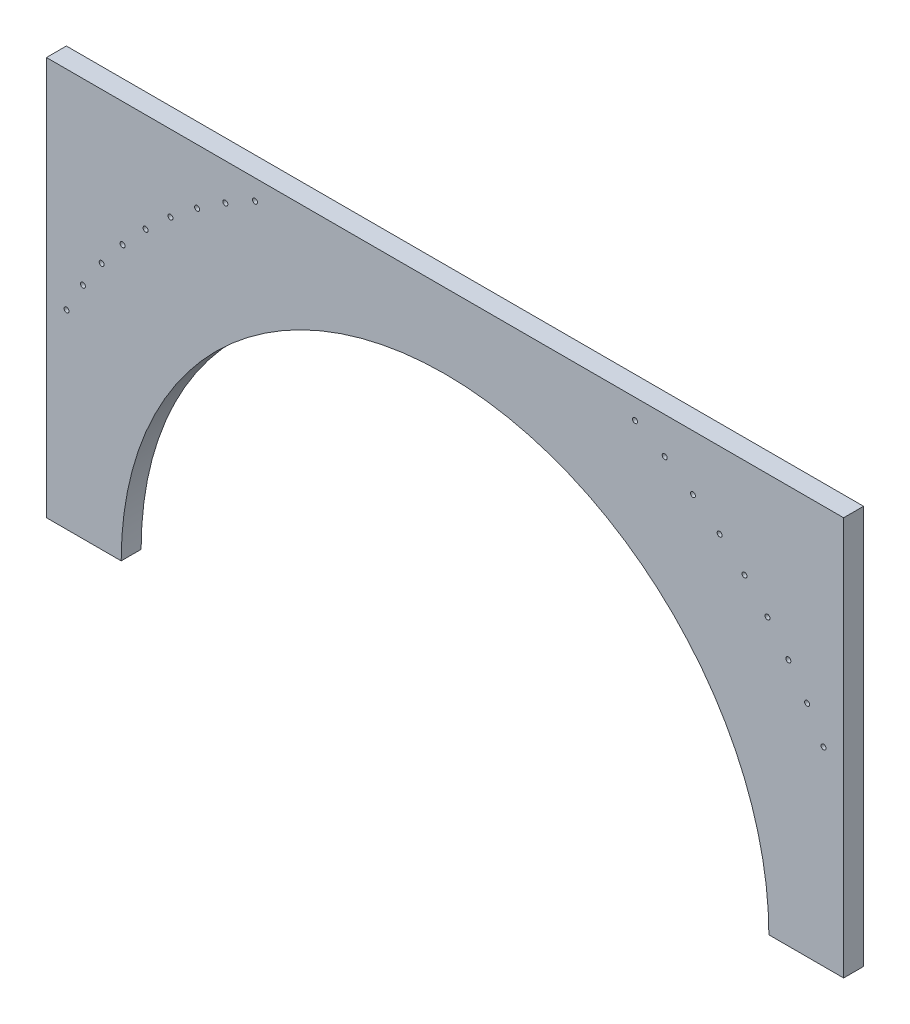
ISO-10303-21;
HEADER;
FILE_DESCRIPTION(('STEP AP214'),'2;1');
FILE_NAME('part.step','',(''),(''),'','','');
FILE_SCHEMA(('AUTOMOTIVE_DESIGN { 1 0 10303 214 1 1 1 1 }'));
ENDSEC;
DATA;
#1=APPLICATION_CONTEXT('core data for automotive mechanical design processes');
#2=APPLICATION_PROTOCOL_DEFINITION('international standard','automotive_design',2000,#1);
#3=PRODUCT_CONTEXT('',#1,'mechanical');
#4=PRODUCT('Part','Part','',(#3));
#5=PRODUCT_RELATED_PRODUCT_CATEGORY('part','',(#4));
#6=PRODUCT_DEFINITION_FORMATION('','',#4);
#7=PRODUCT_DEFINITION_CONTEXT('part definition',#1,'design');
#8=PRODUCT_DEFINITION('design','',#6,#7);
#9=PRODUCT_DEFINITION_SHAPE('','',#8);
#10=(LENGTH_UNIT() NAMED_UNIT(*) SI_UNIT(.MILLI.,.METRE.));
#11=(NAMED_UNIT(*) PLANE_ANGLE_UNIT() SI_UNIT($,.RADIAN.));
#12=(NAMED_UNIT(*) SI_UNIT($,.STERADIAN.) SOLID_ANGLE_UNIT());
#13=UNCERTAINTY_MEASURE_WITH_UNIT(LENGTH_MEASURE(1.E-05),#10,'distance_accuracy_value','');
#14=(GEOMETRIC_REPRESENTATION_CONTEXT(3) GLOBAL_UNCERTAINTY_ASSIGNED_CONTEXT((#13)) GLOBAL_UNIT_ASSIGNED_CONTEXT((#10,
#11,#12)) REPRESENTATION_CONTEXT('',''));
#15=CARTESIAN_POINT('',(0.,0.,0.));
#16=DIRECTION('',(0.,0.,1.));
#17=DIRECTION('',(1.,0.,0.));
#18=AXIS2_PLACEMENT_3D('',#15,#16,#17);
#19=CARTESIAN_POINT('',(40.,0.,2.));
#20=DIRECTION('',(0.,1.,0.));
#21=DIRECTION('',(-1.,0.,0.));
#22=AXIS2_PLACEMENT_3D('',#19,#20,#21);
#23=PLANE('',#22);
#24=DIRECTION('',(1.,0.,0.));
#25=VECTOR('',#24,1.);
#26=CARTESIAN_POINT('',(40.,0.,0.));
#27=LINE('',#26,#25);
#28=CARTESIAN_POINT('',(32.5,0.,0.));
#29=VERTEX_POINT('',#28);
#30=CARTESIAN_POINT('',(40.,0.,0.));
#31=VERTEX_POINT('',#30);
#32=EDGE_CURVE('E117',#29,#31,#27,.T.);
#33=ORIENTED_EDGE('',*,*,#32,.T.);
#34=DIRECTION('',(0.,0.,-1.));
#35=VECTOR('',#34,1.);
#36=CARTESIAN_POINT('',(40.,0.,2.));
#37=LINE('',#36,#35);
#38=CARTESIAN_POINT('',(40.,0.,2.));
#39=VERTEX_POINT('',#38);
#40=EDGE_CURVE('E11',#39,#31,#37,.T.);
#41=ORIENTED_EDGE('',*,*,#40,.F.);
#42=DIRECTION('',(1.,0.,0.));
#43=VECTOR('',#42,1.);
#44=CARTESIAN_POINT('',(40.,0.,2.));
#45=LINE('',#44,#43);
#46=CARTESIAN_POINT('',(32.5,0.,2.));
#47=VERTEX_POINT('',#46);
#48=EDGE_CURVE('E128',#47,#39,#45,.T.);
#49=ORIENTED_EDGE('',*,*,#48,.F.);
#50=DIRECTION('',(0.,0.,-1.));
#51=VECTOR('',#50,1.);
#52=CARTESIAN_POINT('',(32.5,0.,2.));
#53=LINE('',#52,#51);
#54=EDGE_CURVE('E113',#47,#29,#53,.T.);
#55=ORIENTED_EDGE('',*,*,#54,.T.);
#56=EDGE_LOOP('',(#33,#41,#49,#55));
#57=FACE_BOUND('',#56,.T.);
#58=ADVANCED_FACE('F33',(#57),#23,.F.);
#59=CARTESIAN_POINT('',(40.,0.,2.));
#60=DIRECTION('',(-1.,0.,0.));
#61=DIRECTION('',(0.,-1.,0.));
#62=AXIS2_PLACEMENT_3D('',#59,#60,#61);
#63=PLANE('',#62);
#64=DIRECTION('',(0.,1.,0.));
#65=VECTOR('',#64,1.);
#66=CARTESIAN_POINT('',(40.,0.,0.));
#67=LINE('',#66,#65);
#68=CARTESIAN_POINT('',(40.,40.,0.));
#69=VERTEX_POINT('',#68);
#70=EDGE_CURVE('E120',#31,#69,#67,.T.);
#71=ORIENTED_EDGE('',*,*,#70,.T.);
#72=DIRECTION('',(0.,0.,-1.));
#73=VECTOR('',#72,1.);
#74=CARTESIAN_POINT('',(40.,40.,2.));
#75=LINE('',#74,#73);
#76=CARTESIAN_POINT('',(40.,40.,2.));
#77=VERTEX_POINT('',#76);
#78=EDGE_CURVE('E41',#77,#69,#75,.T.);
#79=ORIENTED_EDGE('',*,*,#78,.F.);
#80=DIRECTION('',(0.,1.,0.));
#81=VECTOR('',#80,1.);
#82=CARTESIAN_POINT('',(40.,0.,2.));
#83=LINE('',#82,#81);
#84=EDGE_CURVE('E86',#39,#77,#83,.T.);
#85=ORIENTED_EDGE('',*,*,#84,.F.);
#86=ORIENTED_EDGE('',*,*,#40,.T.);
#87=EDGE_LOOP('',(#71,#79,#85,#86));
#88=FACE_BOUND('',#87,.T.);
#89=ADVANCED_FACE('F153',(#88),#63,.F.);
#90=CARTESIAN_POINT('',(40.,40.,2.));
#91=DIRECTION('',(0.,-1.,0.));
#92=DIRECTION('',(1.,0.,0.));
#93=AXIS2_PLACEMENT_3D('',#90,#91,#92);
#94=PLANE('',#93);
#95=DIRECTION('',(-1.,0.,0.));
#96=VECTOR('',#95,1.);
#97=CARTESIAN_POINT('',(40.,40.,0.));
#98=LINE('',#97,#96);
#99=CARTESIAN_POINT('',(-40.,40.,0.));
#100=VERTEX_POINT('',#99);
#101=EDGE_CURVE('E123',#69,#100,#98,.T.);
#102=ORIENTED_EDGE('',*,*,#101,.T.);
#103=DIRECTION('',(0.,0.,-1.));
#104=VECTOR('',#103,1.);
#105=CARTESIAN_POINT('',(-40.,40.,2.));
#106=LINE('',#105,#104);
#107=CARTESIAN_POINT('',(-40.,40.,2.));
#108=VERTEX_POINT('',#107);
#109=EDGE_CURVE('E108',#108,#100,#106,.T.);
#110=ORIENTED_EDGE('',*,*,#109,.F.);
#111=DIRECTION('',(-1.,0.,0.));
#112=VECTOR('',#111,1.);
#113=CARTESIAN_POINT('',(40.,40.,2.));
#114=LINE('',#113,#112);
#115=EDGE_CURVE('E99',#77,#108,#114,.T.);
#116=ORIENTED_EDGE('',*,*,#115,.F.);
#117=ORIENTED_EDGE('',*,*,#78,.T.);
#118=EDGE_LOOP('',(#102,#110,#116,#117));
#119=FACE_BOUND('',#118,.T.);
#120=ADVANCED_FACE('F134',(#119),#94,.F.);
#121=CARTESIAN_POINT('',(-40.,40.,2.));
#122=DIRECTION('',(1.,0.,0.));
#123=DIRECTION('',(0.,1.,0.));
#124=AXIS2_PLACEMENT_3D('',#121,#122,#123);
#125=PLANE('',#124);
#126=DIRECTION('',(0.,-1.,0.));
#127=VECTOR('',#126,1.);
#128=CARTESIAN_POINT('',(-40.,40.,0.));
#129=LINE('',#128,#127);
#130=CARTESIAN_POINT('',(-40.,0.,0.));
#131=VERTEX_POINT('',#130);
#132=EDGE_CURVE('E107',#100,#131,#129,.T.);
#133=ORIENTED_EDGE('',*,*,#132,.T.);
#134=DIRECTION('',(0.,0.,-1.));
#135=VECTOR('',#134,1.);
#136=CARTESIAN_POINT('',(-40.,0.,2.));
#137=LINE('',#136,#135);
#138=CARTESIAN_POINT('',(-40.,0.,2.));
#139=VERTEX_POINT('',#138);
#140=EDGE_CURVE('E104',#139,#131,#137,.T.);
#141=ORIENTED_EDGE('',*,*,#140,.F.);
#142=DIRECTION('',(0.,-1.,0.));
#143=VECTOR('',#142,1.);
#144=CARTESIAN_POINT('',(-40.,40.,2.));
#145=LINE('',#144,#143);
#146=EDGE_CURVE('E93',#108,#139,#145,.T.);
#147=ORIENTED_EDGE('',*,*,#146,.F.);
#148=ORIENTED_EDGE('',*,*,#109,.T.);
#149=EDGE_LOOP('',(#133,#141,#147,#148));
#150=FACE_BOUND('',#149,.T.);
#151=ADVANCED_FACE('F105',(#150),#125,.F.);
#152=CARTESIAN_POINT('',(-32.5,0.,2.));
#153=DIRECTION('',(0.,1.,0.));
#154=DIRECTION('',(-1.,0.,0.));
#155=AXIS2_PLACEMENT_3D('',#152,#153,#154);
#156=PLANE('',#155);
#157=DIRECTION('',(1.,0.,0.));
#158=VECTOR('',#157,1.);
#159=CARTESIAN_POINT('',(-32.5,0.,0.));
#160=LINE('',#159,#158);
#161=CARTESIAN_POINT('',(-32.5,0.,0.));
#162=VERTEX_POINT('',#161);
#163=EDGE_CURVE('E72',#131,#162,#160,.T.);
#164=ORIENTED_EDGE('',*,*,#163,.T.);
#165=DIRECTION('',(0.,0.,-1.));
#166=VECTOR('',#165,1.);
#167=CARTESIAN_POINT('',(-32.5,0.,2.));
#168=LINE('',#167,#166);
#169=CARTESIAN_POINT('',(-32.5,0.,2.));
#170=VERTEX_POINT('',#169);
#171=EDGE_CURVE('E109',#170,#162,#168,.T.);
#172=ORIENTED_EDGE('',*,*,#171,.F.);
#173=DIRECTION('',(1.,0.,0.));
#174=VECTOR('',#173,1.);
#175=CARTESIAN_POINT('',(-32.5,0.,2.));
#176=LINE('',#175,#174);
#177=EDGE_CURVE('E97',#139,#170,#176,.T.);
#178=ORIENTED_EDGE('',*,*,#177,.F.);
#179=ORIENTED_EDGE('',*,*,#140,.T.);
#180=EDGE_LOOP('',(#164,#172,#178,#179));
#181=FACE_BOUND('',#180,.T.);
#182=ADVANCED_FACE('F111',(#181),#156,.F.);
#183=CARTESIAN_POINT('',(0.,0.,2.));
#184=DIRECTION('',(0.,0.,-1.));
#185=DIRECTION('',(-1.,0.,0.));
#186=AXIS2_PLACEMENT_3D('',#183,#184,#185);
#187=CYLINDRICAL_SURFACE('',#186,32.5);
#188=CARTESIAN_POINT('',(0.,0.,0.));
#189=DIRECTION('',(0.,0.,-1.));
#190=DIRECTION('',(1.,0.,0.));
#191=AXIS2_PLACEMENT_3D('',#188,#189,#190);
#192=CIRCLE('',#191,32.5);
#193=EDGE_CURVE('E78',#162,#29,#192,.T.);
#194=ORIENTED_EDGE('',*,*,#193,.T.);
#195=ORIENTED_EDGE('',*,*,#54,.F.);
#196=CARTESIAN_POINT('',(0.,0.,2.));
#197=DIRECTION('',(0.,0.,-1.));
#198=DIRECTION('',(1.,0.,0.));
#199=AXIS2_PLACEMENT_3D('',#196,#197,#198);
#200=CIRCLE('',#199,32.5);
#201=EDGE_CURVE('E49',#170,#47,#200,.T.);
#202=ORIENTED_EDGE('',*,*,#201,.F.);
#203=ORIENTED_EDGE('',*,*,#171,.T.);
#204=EDGE_LOOP('',(#194,#195,#202,#203));
#205=FACE_BOUND('',#204,.T.);
#206=ADVANCED_FACE('F141',(#205),#187,.F.);
#207=CARTESIAN_POINT('',(0.,0.,2.));
#208=DIRECTION('',(0.,0.,1.));
#209=DIRECTION('',(1.,0.,0.));
#210=AXIS2_PLACEMENT_3D('',#207,#208,#209);
#211=PLANE('',#210);
#212=CARTESIAN_POINT('',(37.9814539466944,19.0698493988598,2.));
#213=DIRECTION('',(0.,0.,1.));
#214=DIRECTION('',(-1.,0.,0.));
#215=AXIS2_PLACEMENT_3D('',#212,#213,#214);
#216=CIRCLE('',#215,0.25);
#217=CARTESIAN_POINT('',(37.7314539466944,19.0698493988598,2.));
#218=VERTEX_POINT('',#217);
#219=EDGE_CURVE('E379',#218,#218,#216,.T.);
#220=ORIENTED_EDGE('',*,*,#219,.F.);
#221=EDGE_LOOP('',(#220));
#222=FACE_BOUND('',#221,.T.);
#223=CARTESIAN_POINT('',(36.3355463010969,22.0449104103625,2.));
#224=DIRECTION('',(0.,0.,1.));
#225=DIRECTION('',(-1.,0.,0.));
#226=AXIS2_PLACEMENT_3D('',#223,#224,#225);
#227=CIRCLE('',#226,0.25);
#228=CARTESIAN_POINT('',(36.0855463010969,22.0449104103625,2.));
#229=VERTEX_POINT('',#228);
#230=EDGE_CURVE('E381',#229,#229,#227,.T.);
#231=ORIENTED_EDGE('',*,*,#230,.F.);
#232=EDGE_LOOP('',(#231));
#233=FACE_BOUND('',#232,.T.);
#234=CARTESIAN_POINT('',(34.4570911591722,24.8788839952389,2.));
#235=DIRECTION('',(0.,0.,1.));
#236=DIRECTION('',(-1.,0.,0.));
#237=AXIS2_PLACEMENT_3D('',#234,#235,#236);
#238=CIRCLE('',#237,0.249999999999993);
#239=CARTESIAN_POINT('',(34.2070911591723,24.8788839952389,2.));
#240=VERTEX_POINT('',#239);
#241=EDGE_CURVE('E387',#240,#240,#238,.T.);
#242=ORIENTED_EDGE('',*,*,#241,.F.);
#243=EDGE_LOOP('',(#242));
#244=FACE_BOUND('',#243,.T.);
#245=CARTESIAN_POINT('',(32.358110633829,27.5536327225457,2.));
#246=DIRECTION('',(0.,0.,1.));
#247=DIRECTION('',(-1.,0.,0.));
#248=AXIS2_PLACEMENT_3D('',#245,#246,#247);
#249=CIRCLE('',#248,0.250000000000006);
#250=CARTESIAN_POINT('',(32.1081106338289,27.5536327225457,2.));
#251=VERTEX_POINT('',#250);
#252=EDGE_CURVE('E393',#251,#251,#249,.T.);
#253=ORIENTED_EDGE('',*,*,#252,.F.);
#254=EDGE_LOOP('',(#253));
#255=FACE_BOUND('',#254,.T.);
#256=CARTESIAN_POINT('',(30.0520382004291,30.0520382004283,2.));
#257=DIRECTION('',(0.,0.,1.));
#258=DIRECTION('',(-1.,0.,0.));
#259=AXIS2_PLACEMENT_3D('',#256,#257,#258);
#260=CIRCLE('',#259,0.249999999999992);
#261=CARTESIAN_POINT('',(29.8020382004291,30.0520382004283,2.));
#262=VERTEX_POINT('',#261);
#263=EDGE_CURVE('E399',#262,#262,#260,.T.);
#264=ORIENTED_EDGE('',*,*,#263,.F.);
#265=EDGE_LOOP('',(#264));
#266=FACE_BOUND('',#265,.T.);
#267=CARTESIAN_POINT('',(27.5536327225466,32.358110633828,2.));
#268=DIRECTION('',(0.,0.,1.));
#269=DIRECTION('',(-1.,0.,0.));
#270=AXIS2_PLACEMENT_3D('',#267,#268,#269);
#271=CIRCLE('',#270,0.25);
#272=CARTESIAN_POINT('',(27.3036327225466,32.358110633828,2.));
#273=VERTEX_POINT('',#272);
#274=EDGE_CURVE('E405',#273,#273,#271,.T.);
#275=ORIENTED_EDGE('',*,*,#274,.F.);
#276=EDGE_LOOP('',(#275));
#277=FACE_BOUND('',#276,.T.);
#278=CARTESIAN_POINT('',(24.8788839952397,34.4570911591713,2.));
#279=DIRECTION('',(0.,0.,1.));
#280=DIRECTION('',(-1.,0.,0.));
#281=AXIS2_PLACEMENT_3D('',#278,#279,#280);
#282=CIRCLE('',#281,0.250000000000003);
#283=CARTESIAN_POINT('',(24.6288839952397,34.4570911591713,2.));
#284=VERTEX_POINT('',#283);
#285=EDGE_CURVE('E411',#284,#284,#282,.T.);
#286=ORIENTED_EDGE('',*,*,#285,.F.);
#287=EDGE_LOOP('',(#286));
#288=FACE_BOUND('',#287,.T.);
#289=CARTESIAN_POINT('',(22.0449104103634,36.335546301096,2.));
#290=DIRECTION('',(0.,0.,1.));
#291=DIRECTION('',(-1.,0.,0.));
#292=AXIS2_PLACEMENT_3D('',#289,#290,#291);
#293=CIRCLE('',#292,0.25);
#294=CARTESIAN_POINT('',(21.7949104103634,36.335546301096,2.));
#295=VERTEX_POINT('',#294);
#296=EDGE_CURVE('E417',#295,#295,#293,.T.);
#297=ORIENTED_EDGE('',*,*,#296,.F.);
#298=EDGE_LOOP('',(#297));
#299=FACE_BOUND('',#298,.T.);
#300=CARTESIAN_POINT('',(19.0698493988607,37.9814539466935,2.));
#301=DIRECTION('',(0.,0.,1.));
#302=DIRECTION('',(-1.,0.,0.));
#303=AXIS2_PLACEMENT_3D('',#300,#301,#302);
#304=CIRCLE('',#303,0.250000000000006);
#305=CARTESIAN_POINT('',(18.8198493988607,37.9814539466935,2.));
#306=VERTEX_POINT('',#305);
#307=EDGE_CURVE('E423',#306,#306,#304,.T.);
#308=ORIENTED_EDGE('',*,*,#307,.F.);
#309=EDGE_LOOP('',(#308));
#310=FACE_BOUND('',#309,.T.);
#311=CARTESIAN_POINT('',(-19.0698493988607,37.9814539466935,2.));
#312=DIRECTION('',(0.,0.,1.));
#313=DIRECTION('',(1.,0.,0.));
#314=AXIS2_PLACEMENT_3D('',#311,#312,#313);
#315=CIRCLE('',#314,0.250000000000006);
#316=CARTESIAN_POINT('',(-18.8198493988607,37.9814539466935,2.));
#317=VERTEX_POINT('',#316);
#318=EDGE_CURVE('E429',#317,#317,#315,.T.);
#319=ORIENTED_EDGE('',*,*,#318,.F.);
#320=EDGE_LOOP('',(#319));
#321=FACE_BOUND('',#320,.T.);
#322=CARTESIAN_POINT('',(-22.0449104103634,36.335546301096,2.));
#323=DIRECTION('',(0.,0.,1.));
#324=DIRECTION('',(1.,0.,0.));
#325=AXIS2_PLACEMENT_3D('',#322,#323,#324);
#326=CIRCLE('',#325,0.25);
#327=CARTESIAN_POINT('',(-21.7949104103634,36.335546301096,2.));
#328=VERTEX_POINT('',#327);
#329=EDGE_CURVE('E435',#328,#328,#326,.T.);
#330=ORIENTED_EDGE('',*,*,#329,.F.);
#331=EDGE_LOOP('',(#330));
#332=FACE_BOUND('',#331,.T.);
#333=CARTESIAN_POINT('',(-24.8788839952397,34.4570911591713,2.));
#334=DIRECTION('',(0.,0.,1.));
#335=DIRECTION('',(1.,0.,0.));
#336=AXIS2_PLACEMENT_3D('',#333,#334,#335);
#337=CIRCLE('',#336,0.250000000000003);
#338=CARTESIAN_POINT('',(-24.6288839952397,34.4570911591713,2.));
#339=VERTEX_POINT('',#338);
#340=EDGE_CURVE('E441',#339,#339,#337,.T.);
#341=ORIENTED_EDGE('',*,*,#340,.F.);
#342=EDGE_LOOP('',(#341));
#343=FACE_BOUND('',#342,.T.);
#344=CARTESIAN_POINT('',(-27.5536327225466,32.358110633828,2.));
#345=DIRECTION('',(0.,0.,1.));
#346=DIRECTION('',(1.,0.,0.));
#347=AXIS2_PLACEMENT_3D('',#344,#345,#346);
#348=CIRCLE('',#347,0.25);
#349=CARTESIAN_POINT('',(-27.3036327225466,32.358110633828,2.));
#350=VERTEX_POINT('',#349);
#351=EDGE_CURVE('E447',#350,#350,#348,.T.);
#352=ORIENTED_EDGE('',*,*,#351,.F.);
#353=EDGE_LOOP('',(#352));
#354=FACE_BOUND('',#353,.T.);
#355=CARTESIAN_POINT('',(-30.0520382004291,30.0520382004283,2.));
#356=DIRECTION('',(0.,0.,1.));
#357=DIRECTION('',(1.,0.,0.));
#358=AXIS2_PLACEMENT_3D('',#355,#356,#357);
#359=CIRCLE('',#358,0.249999999999992);
#360=CARTESIAN_POINT('',(-29.8020382004291,30.0520382004283,2.));
#361=VERTEX_POINT('',#360);
#362=EDGE_CURVE('E453',#361,#361,#359,.T.);
#363=ORIENTED_EDGE('',*,*,#362,.F.);
#364=EDGE_LOOP('',(#363));
#365=FACE_BOUND('',#364,.T.);
#366=CARTESIAN_POINT('',(-32.358110633829,27.5536327225457,2.));
#367=DIRECTION('',(0.,0.,1.));
#368=DIRECTION('',(1.,0.,0.));
#369=AXIS2_PLACEMENT_3D('',#366,#367,#368);
#370=CIRCLE('',#369,0.250000000000006);
#371=CARTESIAN_POINT('',(-32.1081106338289,27.5536327225457,2.));
#372=VERTEX_POINT('',#371);
#373=EDGE_CURVE('E459',#372,#372,#370,.T.);
#374=ORIENTED_EDGE('',*,*,#373,.F.);
#375=EDGE_LOOP('',(#374));
#376=FACE_BOUND('',#375,.T.);
#377=CARTESIAN_POINT('',(-34.4570911591722,24.8788839952389,2.));
#378=DIRECTION('',(0.,0.,1.));
#379=DIRECTION('',(1.,0.,0.));
#380=AXIS2_PLACEMENT_3D('',#377,#378,#379);
#381=CIRCLE('',#380,0.249999999999993);
#382=CARTESIAN_POINT('',(-34.2070911591723,24.8788839952389,2.));
#383=VERTEX_POINT('',#382);
#384=EDGE_CURVE('E465',#383,#383,#381,.T.);
#385=ORIENTED_EDGE('',*,*,#384,.F.);
#386=EDGE_LOOP('',(#385));
#387=FACE_BOUND('',#386,.T.);
#388=CARTESIAN_POINT('',(-36.3355463010969,22.0449104103625,2.));
#389=DIRECTION('',(0.,0.,1.));
#390=DIRECTION('',(1.,0.,0.));
#391=AXIS2_PLACEMENT_3D('',#388,#389,#390);
#392=CIRCLE('',#391,0.25);
#393=CARTESIAN_POINT('',(-36.0855463010969,22.0449104103625,2.));
#394=VERTEX_POINT('',#393);
#395=EDGE_CURVE('E471',#394,#394,#392,.T.);
#396=ORIENTED_EDGE('',*,*,#395,.F.);
#397=EDGE_LOOP('',(#396));
#398=FACE_BOUND('',#397,.T.);
#399=CARTESIAN_POINT('',(-37.9814539466944,19.0698493988598,2.));
#400=DIRECTION('',(0.,0.,1.));
#401=DIRECTION('',(1.,0.,0.));
#402=AXIS2_PLACEMENT_3D('',#399,#400,#401);
#403=CIRCLE('',#402,0.25);
#404=CARTESIAN_POINT('',(-37.7314539466944,19.0698493988598,2.));
#405=VERTEX_POINT('',#404);
#406=EDGE_CURVE('E477',#405,#405,#403,.T.);
#407=ORIENTED_EDGE('',*,*,#406,.F.);
#408=EDGE_LOOP('',(#407));
#409=FACE_BOUND('',#408,.T.);
#410=ORIENTED_EDGE('',*,*,#48,.T.);
#411=ORIENTED_EDGE('',*,*,#84,.T.);
#412=ORIENTED_EDGE('',*,*,#115,.T.);
#413=ORIENTED_EDGE('',*,*,#146,.T.);
#414=ORIENTED_EDGE('',*,*,#177,.T.);
#415=ORIENTED_EDGE('',*,*,#201,.T.);
#416=EDGE_LOOP('',(#410,#411,#412,#413,#414,#415));
#417=FACE_BOUND('',#416,.T.);
#418=ADVANCED_FACE('F95',(#222,#233,#244,#255,#266,#277,#288,#299,#310,#321,#332,#343,#354,#365,
#376,#387,#398,#409,#417),#211,.T.);
#419=CARTESIAN_POINT('',(0.,0.,0.));
#420=DIRECTION('',(0.,0.,1.));
#421=DIRECTION('',(1.,0.,0.));
#422=AXIS2_PLACEMENT_3D('',#419,#420,#421);
#423=PLANE('',#422);
#424=CARTESIAN_POINT('',(37.9814539466944,19.0698493988598,0.));
#425=DIRECTION('',(0.,0.,1.));
#426=DIRECTION('',(-1.,0.,0.));
#427=AXIS2_PLACEMENT_3D('',#424,#425,#426);
#428=CIRCLE('',#427,0.25);
#429=CARTESIAN_POINT('',(37.7314539466944,19.0698493988598,0.));
#430=VERTEX_POINT('',#429);
#431=EDGE_CURVE('E376',#430,#430,#428,.T.);
#432=ORIENTED_EDGE('',*,*,#431,.T.);
#433=EDGE_LOOP('',(#432));
#434=FACE_BOUND('',#433,.T.);
#435=CARTESIAN_POINT('',(36.3355463010969,22.0449104103625,0.));
#436=DIRECTION('',(0.,0.,1.));
#437=DIRECTION('',(-1.,0.,0.));
#438=AXIS2_PLACEMENT_3D('',#435,#436,#437);
#439=CIRCLE('',#438,0.25);
#440=CARTESIAN_POINT('',(36.0855463010969,22.0449104103625,0.));
#441=VERTEX_POINT('',#440);
#442=EDGE_CURVE('E384',#441,#441,#439,.T.);
#443=ORIENTED_EDGE('',*,*,#442,.T.);
#444=EDGE_LOOP('',(#443));
#445=FACE_BOUND('',#444,.T.);
#446=CARTESIAN_POINT('',(34.4570911591722,24.8788839952389,0.));
#447=DIRECTION('',(0.,0.,1.));
#448=DIRECTION('',(-1.,0.,0.));
#449=AXIS2_PLACEMENT_3D('',#446,#447,#448);
#450=CIRCLE('',#449,0.249999999999993);
#451=CARTESIAN_POINT('',(34.2070911591723,24.8788839952389,0.));
#452=VERTEX_POINT('',#451);
#453=EDGE_CURVE('E390',#452,#452,#450,.T.);
#454=ORIENTED_EDGE('',*,*,#453,.T.);
#455=EDGE_LOOP('',(#454));
#456=FACE_BOUND('',#455,.T.);
#457=CARTESIAN_POINT('',(32.358110633829,27.5536327225457,0.));
#458=DIRECTION('',(0.,0.,1.));
#459=DIRECTION('',(-1.,0.,0.));
#460=AXIS2_PLACEMENT_3D('',#457,#458,#459);
#461=CIRCLE('',#460,0.250000000000006);
#462=CARTESIAN_POINT('',(32.1081106338289,27.5536327225457,0.));
#463=VERTEX_POINT('',#462);
#464=EDGE_CURVE('E396',#463,#463,#461,.T.);
#465=ORIENTED_EDGE('',*,*,#464,.T.);
#466=EDGE_LOOP('',(#465));
#467=FACE_BOUND('',#466,.T.);
#468=CARTESIAN_POINT('',(30.0520382004291,30.0520382004283,0.));
#469=DIRECTION('',(0.,0.,1.));
#470=DIRECTION('',(-1.,0.,0.));
#471=AXIS2_PLACEMENT_3D('',#468,#469,#470);
#472=CIRCLE('',#471,0.249999999999992);
#473=CARTESIAN_POINT('',(29.8020382004291,30.0520382004283,0.));
#474=VERTEX_POINT('',#473);
#475=EDGE_CURVE('E402',#474,#474,#472,.T.);
#476=ORIENTED_EDGE('',*,*,#475,.T.);
#477=EDGE_LOOP('',(#476));
#478=FACE_BOUND('',#477,.T.);
#479=CARTESIAN_POINT('',(27.5536327225466,32.358110633828,0.));
#480=DIRECTION('',(0.,0.,1.));
#481=DIRECTION('',(-1.,0.,0.));
#482=AXIS2_PLACEMENT_3D('',#479,#480,#481);
#483=CIRCLE('',#482,0.25);
#484=CARTESIAN_POINT('',(27.3036327225466,32.358110633828,0.));
#485=VERTEX_POINT('',#484);
#486=EDGE_CURVE('E408',#485,#485,#483,.T.);
#487=ORIENTED_EDGE('',*,*,#486,.T.);
#488=EDGE_LOOP('',(#487));
#489=FACE_BOUND('',#488,.T.);
#490=CARTESIAN_POINT('',(24.8788839952397,34.4570911591713,0.));
#491=DIRECTION('',(0.,0.,1.));
#492=DIRECTION('',(-1.,0.,0.));
#493=AXIS2_PLACEMENT_3D('',#490,#491,#492);
#494=CIRCLE('',#493,0.250000000000003);
#495=CARTESIAN_POINT('',(24.6288839952397,34.4570911591713,0.));
#496=VERTEX_POINT('',#495);
#497=EDGE_CURVE('E414',#496,#496,#494,.T.);
#498=ORIENTED_EDGE('',*,*,#497,.T.);
#499=EDGE_LOOP('',(#498));
#500=FACE_BOUND('',#499,.T.);
#501=CARTESIAN_POINT('',(22.0449104103634,36.335546301096,0.));
#502=DIRECTION('',(0.,0.,1.));
#503=DIRECTION('',(-1.,0.,0.));
#504=AXIS2_PLACEMENT_3D('',#501,#502,#503);
#505=CIRCLE('',#504,0.25);
#506=CARTESIAN_POINT('',(21.7949104103634,36.335546301096,0.));
#507=VERTEX_POINT('',#506);
#508=EDGE_CURVE('E420',#507,#507,#505,.T.);
#509=ORIENTED_EDGE('',*,*,#508,.T.);
#510=EDGE_LOOP('',(#509));
#511=FACE_BOUND('',#510,.T.);
#512=CARTESIAN_POINT('',(19.0698493988607,37.9814539466935,0.));
#513=DIRECTION('',(0.,0.,1.));
#514=DIRECTION('',(-1.,0.,0.));
#515=AXIS2_PLACEMENT_3D('',#512,#513,#514);
#516=CIRCLE('',#515,0.250000000000006);
#517=CARTESIAN_POINT('',(18.8198493988607,37.9814539466935,0.));
#518=VERTEX_POINT('',#517);
#519=EDGE_CURVE('E426',#518,#518,#516,.T.);
#520=ORIENTED_EDGE('',*,*,#519,.T.);
#521=EDGE_LOOP('',(#520));
#522=FACE_BOUND('',#521,.T.);
#523=CARTESIAN_POINT('',(-19.0698493988607,37.9814539466935,0.));
#524=DIRECTION('',(0.,0.,1.));
#525=DIRECTION('',(1.,0.,0.));
#526=AXIS2_PLACEMENT_3D('',#523,#524,#525);
#527=CIRCLE('',#526,0.250000000000006);
#528=CARTESIAN_POINT('',(-18.8198493988607,37.9814539466935,0.));
#529=VERTEX_POINT('',#528);
#530=EDGE_CURVE('E432',#529,#529,#527,.T.);
#531=ORIENTED_EDGE('',*,*,#530,.T.);
#532=EDGE_LOOP('',(#531));
#533=FACE_BOUND('',#532,.T.);
#534=CARTESIAN_POINT('',(-22.0449104103634,36.335546301096,0.));
#535=DIRECTION('',(0.,0.,1.));
#536=DIRECTION('',(1.,0.,0.));
#537=AXIS2_PLACEMENT_3D('',#534,#535,#536);
#538=CIRCLE('',#537,0.25);
#539=CARTESIAN_POINT('',(-21.7949104103634,36.335546301096,0.));
#540=VERTEX_POINT('',#539);
#541=EDGE_CURVE('E438',#540,#540,#538,.T.);
#542=ORIENTED_EDGE('',*,*,#541,.T.);
#543=EDGE_LOOP('',(#542));
#544=FACE_BOUND('',#543,.T.);
#545=CARTESIAN_POINT('',(-24.8788839952397,34.4570911591713,0.));
#546=DIRECTION('',(0.,0.,1.));
#547=DIRECTION('',(1.,0.,0.));
#548=AXIS2_PLACEMENT_3D('',#545,#546,#547);
#549=CIRCLE('',#548,0.250000000000003);
#550=CARTESIAN_POINT('',(-24.6288839952397,34.4570911591713,0.));
#551=VERTEX_POINT('',#550);
#552=EDGE_CURVE('E444',#551,#551,#549,.T.);
#553=ORIENTED_EDGE('',*,*,#552,.T.);
#554=EDGE_LOOP('',(#553));
#555=FACE_BOUND('',#554,.T.);
#556=CARTESIAN_POINT('',(-27.5536327225466,32.358110633828,0.));
#557=DIRECTION('',(0.,0.,1.));
#558=DIRECTION('',(1.,0.,0.));
#559=AXIS2_PLACEMENT_3D('',#556,#557,#558);
#560=CIRCLE('',#559,0.25);
#561=CARTESIAN_POINT('',(-27.3036327225466,32.358110633828,0.));
#562=VERTEX_POINT('',#561);
#563=EDGE_CURVE('E450',#562,#562,#560,.T.);
#564=ORIENTED_EDGE('',*,*,#563,.T.);
#565=EDGE_LOOP('',(#564));
#566=FACE_BOUND('',#565,.T.);
#567=CARTESIAN_POINT('',(-30.0520382004291,30.0520382004283,0.));
#568=DIRECTION('',(0.,0.,1.));
#569=DIRECTION('',(1.,0.,0.));
#570=AXIS2_PLACEMENT_3D('',#567,#568,#569);
#571=CIRCLE('',#570,0.249999999999992);
#572=CARTESIAN_POINT('',(-29.8020382004291,30.0520382004283,0.));
#573=VERTEX_POINT('',#572);
#574=EDGE_CURVE('E456',#573,#573,#571,.T.);
#575=ORIENTED_EDGE('',*,*,#574,.T.);
#576=EDGE_LOOP('',(#575));
#577=FACE_BOUND('',#576,.T.);
#578=CARTESIAN_POINT('',(-32.358110633829,27.5536327225457,0.));
#579=DIRECTION('',(0.,0.,1.));
#580=DIRECTION('',(1.,0.,0.));
#581=AXIS2_PLACEMENT_3D('',#578,#579,#580);
#582=CIRCLE('',#581,0.250000000000006);
#583=CARTESIAN_POINT('',(-32.1081106338289,27.5536327225457,0.));
#584=VERTEX_POINT('',#583);
#585=EDGE_CURVE('E462',#584,#584,#582,.T.);
#586=ORIENTED_EDGE('',*,*,#585,.T.);
#587=EDGE_LOOP('',(#586));
#588=FACE_BOUND('',#587,.T.);
#589=CARTESIAN_POINT('',(-34.4570911591722,24.8788839952389,0.));
#590=DIRECTION('',(0.,0.,1.));
#591=DIRECTION('',(1.,0.,0.));
#592=AXIS2_PLACEMENT_3D('',#589,#590,#591);
#593=CIRCLE('',#592,0.249999999999993);
#594=CARTESIAN_POINT('',(-34.2070911591723,24.8788839952389,0.));
#595=VERTEX_POINT('',#594);
#596=EDGE_CURVE('E468',#595,#595,#593,.T.);
#597=ORIENTED_EDGE('',*,*,#596,.T.);
#598=EDGE_LOOP('',(#597));
#599=FACE_BOUND('',#598,.T.);
#600=CARTESIAN_POINT('',(-36.3355463010969,22.0449104103625,0.));
#601=DIRECTION('',(0.,0.,1.));
#602=DIRECTION('',(1.,0.,0.));
#603=AXIS2_PLACEMENT_3D('',#600,#601,#602);
#604=CIRCLE('',#603,0.25);
#605=CARTESIAN_POINT('',(-36.0855463010969,22.0449104103625,0.));
#606=VERTEX_POINT('',#605);
#607=EDGE_CURVE('E474',#606,#606,#604,.T.);
#608=ORIENTED_EDGE('',*,*,#607,.T.);
#609=EDGE_LOOP('',(#608));
#610=FACE_BOUND('',#609,.T.);
#611=CARTESIAN_POINT('',(-37.9814539466944,19.0698493988598,0.));
#612=DIRECTION('',(0.,0.,1.));
#613=DIRECTION('',(1.,0.,0.));
#614=AXIS2_PLACEMENT_3D('',#611,#612,#613);
#615=CIRCLE('',#614,0.25);
#616=CARTESIAN_POINT('',(-37.7314539466944,19.0698493988598,0.));
#617=VERTEX_POINT('',#616);
#618=EDGE_CURVE('E121',#617,#617,#615,.T.);
#619=ORIENTED_EDGE('',*,*,#618,.T.);
#620=EDGE_LOOP('',(#619));
#621=FACE_BOUND('',#620,.T.);
#622=ORIENTED_EDGE('',*,*,#32,.F.);
#623=ORIENTED_EDGE('',*,*,#193,.F.);
#624=ORIENTED_EDGE('',*,*,#163,.F.);
#625=ORIENTED_EDGE('',*,*,#132,.F.);
#626=ORIENTED_EDGE('',*,*,#101,.F.);
#627=ORIENTED_EDGE('',*,*,#70,.F.);
#628=EDGE_LOOP('',(#622,#623,#624,#625,#626,#627));
#629=FACE_BOUND('',#628,.T.);
#630=ADVANCED_FACE('F137',(#434,#445,#456,#467,#478,#489,#500,#511,#522,#533,#544,#555,#566,
#577,#588,#599,#610,#621,#629),#423,.F.);
#631=CARTESIAN_POINT('',(-37.9814539466944,19.0698493988598,0.));
#632=DIRECTION('',(0.,0.,1.));
#633=DIRECTION('',(1.,0.,0.));
#634=AXIS2_PLACEMENT_3D('',#631,#632,#633);
#635=CYLINDRICAL_SURFACE('',#634,0.25);
#636=ORIENTED_EDGE('',*,*,#618,.F.);
#637=EDGE_LOOP('',(#636));
#638=FACE_BOUND('',#637,.T.);
#639=ORIENTED_EDGE('',*,*,#406,.T.);
#640=EDGE_LOOP('',(#639));
#641=FACE_BOUND('',#640,.T.);
#642=ADVANCED_FACE('F190',(#638,#641),#635,.F.);
#643=CARTESIAN_POINT('',(-36.3355463010969,22.0449104103625,0.));
#644=DIRECTION('',(0.,0.,1.));
#645=DIRECTION('',(1.,0.,0.));
#646=AXIS2_PLACEMENT_3D('',#643,#644,#645);
#647=CYLINDRICAL_SURFACE('',#646,0.25);
#648=ORIENTED_EDGE('',*,*,#607,.F.);
#649=EDGE_LOOP('',(#648));
#650=FACE_BOUND('',#649,.T.);
#651=ORIENTED_EDGE('',*,*,#395,.T.);
#652=EDGE_LOOP('',(#651));
#653=FACE_BOUND('',#652,.T.);
#654=ADVANCED_FACE('F199',(#650,#653),#647,.F.);
#655=CARTESIAN_POINT('',(-34.4570911591722,24.8788839952389,0.));
#656=DIRECTION('',(0.,0.,1.));
#657=DIRECTION('',(1.,0.,0.));
#658=AXIS2_PLACEMENT_3D('',#655,#656,#657);
#659=CYLINDRICAL_SURFACE('',#658,0.249999999999993);
#660=ORIENTED_EDGE('',*,*,#596,.F.);
#661=EDGE_LOOP('',(#660));
#662=FACE_BOUND('',#661,.T.);
#663=ORIENTED_EDGE('',*,*,#384,.T.);
#664=EDGE_LOOP('',(#663));
#665=FACE_BOUND('',#664,.T.);
#666=ADVANCED_FACE('F209',(#662,#665),#659,.F.);
#667=CARTESIAN_POINT('',(-32.358110633829,27.5536327225457,0.));
#668=DIRECTION('',(0.,0.,1.));
#669=DIRECTION('',(1.,0.,0.));
#670=AXIS2_PLACEMENT_3D('',#667,#668,#669);
#671=CYLINDRICAL_SURFACE('',#670,0.250000000000006);
#672=ORIENTED_EDGE('',*,*,#585,.F.);
#673=EDGE_LOOP('',(#672));
#674=FACE_BOUND('',#673,.T.);
#675=ORIENTED_EDGE('',*,*,#373,.T.);
#676=EDGE_LOOP('',(#675));
#677=FACE_BOUND('',#676,.T.);
#678=ADVANCED_FACE('F219',(#674,#677),#671,.F.);
#679=CARTESIAN_POINT('',(-30.0520382004291,30.0520382004283,0.));
#680=DIRECTION('',(0.,0.,1.));
#681=DIRECTION('',(1.,0.,0.));
#682=AXIS2_PLACEMENT_3D('',#679,#680,#681);
#683=CYLINDRICAL_SURFACE('',#682,0.249999999999992);
#684=ORIENTED_EDGE('',*,*,#574,.F.);
#685=EDGE_LOOP('',(#684));
#686=FACE_BOUND('',#685,.T.);
#687=ORIENTED_EDGE('',*,*,#362,.T.);
#688=EDGE_LOOP('',(#687));
#689=FACE_BOUND('',#688,.T.);
#690=ADVANCED_FACE('F229',(#686,#689),#683,.F.);
#691=CARTESIAN_POINT('',(-27.5536327225466,32.358110633828,0.));
#692=DIRECTION('',(0.,0.,1.));
#693=DIRECTION('',(1.,0.,0.));
#694=AXIS2_PLACEMENT_3D('',#691,#692,#693);
#695=CYLINDRICAL_SURFACE('',#694,0.25);
#696=ORIENTED_EDGE('',*,*,#563,.F.);
#697=EDGE_LOOP('',(#696));
#698=FACE_BOUND('',#697,.T.);
#699=ORIENTED_EDGE('',*,*,#351,.T.);
#700=EDGE_LOOP('',(#699));
#701=FACE_BOUND('',#700,.T.);
#702=ADVANCED_FACE('F239',(#698,#701),#695,.F.);
#703=CARTESIAN_POINT('',(-24.8788839952397,34.4570911591713,0.));
#704=DIRECTION('',(0.,0.,1.));
#705=DIRECTION('',(1.,0.,0.));
#706=AXIS2_PLACEMENT_3D('',#703,#704,#705);
#707=CYLINDRICAL_SURFACE('',#706,0.250000000000003);
#708=ORIENTED_EDGE('',*,*,#552,.F.);
#709=EDGE_LOOP('',(#708));
#710=FACE_BOUND('',#709,.T.);
#711=ORIENTED_EDGE('',*,*,#340,.T.);
#712=EDGE_LOOP('',(#711));
#713=FACE_BOUND('',#712,.T.);
#714=ADVANCED_FACE('F249',(#710,#713),#707,.F.);
#715=CARTESIAN_POINT('',(-22.0449104103634,36.335546301096,0.));
#716=DIRECTION('',(0.,0.,1.));
#717=DIRECTION('',(1.,0.,0.));
#718=AXIS2_PLACEMENT_3D('',#715,#716,#717);
#719=CYLINDRICAL_SURFACE('',#718,0.25);
#720=ORIENTED_EDGE('',*,*,#541,.F.);
#721=EDGE_LOOP('',(#720));
#722=FACE_BOUND('',#721,.T.);
#723=ORIENTED_EDGE('',*,*,#329,.T.);
#724=EDGE_LOOP('',(#723));
#725=FACE_BOUND('',#724,.T.);
#726=ADVANCED_FACE('F259',(#722,#725),#719,.F.);
#727=CARTESIAN_POINT('',(-19.0698493988607,37.9814539466935,0.));
#728=DIRECTION('',(0.,0.,1.));
#729=DIRECTION('',(1.,0.,0.));
#730=AXIS2_PLACEMENT_3D('',#727,#728,#729);
#731=CYLINDRICAL_SURFACE('',#730,0.250000000000006);
#732=ORIENTED_EDGE('',*,*,#530,.F.);
#733=EDGE_LOOP('',(#732));
#734=FACE_BOUND('',#733,.T.);
#735=ORIENTED_EDGE('',*,*,#318,.T.);
#736=EDGE_LOOP('',(#735));
#737=FACE_BOUND('',#736,.T.);
#738=ADVANCED_FACE('F269',(#734,#737),#731,.F.);
#739=CARTESIAN_POINT('',(19.0698493988607,37.9814539466935,0.));
#740=DIRECTION('',(0.,0.,1.));
#741=DIRECTION('',(1.,0.,0.));
#742=AXIS2_PLACEMENT_3D('',#739,#740,#741);
#743=CYLINDRICAL_SURFACE('',#742,0.250000000000006);
#744=ORIENTED_EDGE('',*,*,#519,.F.);
#745=EDGE_LOOP('',(#744));
#746=FACE_BOUND('',#745,.T.);
#747=ORIENTED_EDGE('',*,*,#307,.T.);
#748=EDGE_LOOP('',(#747));
#749=FACE_BOUND('',#748,.T.);
#750=ADVANCED_FACE('F279',(#746,#749),#743,.F.);
#751=CARTESIAN_POINT('',(22.0449104103634,36.335546301096,0.));
#752=DIRECTION('',(0.,0.,1.));
#753=DIRECTION('',(1.,0.,0.));
#754=AXIS2_PLACEMENT_3D('',#751,#752,#753);
#755=CYLINDRICAL_SURFACE('',#754,0.25);
#756=ORIENTED_EDGE('',*,*,#508,.F.);
#757=EDGE_LOOP('',(#756));
#758=FACE_BOUND('',#757,.T.);
#759=ORIENTED_EDGE('',*,*,#296,.T.);
#760=EDGE_LOOP('',(#759));
#761=FACE_BOUND('',#760,.T.);
#762=ADVANCED_FACE('F289',(#758,#761),#755,.F.);
#763=CARTESIAN_POINT('',(24.8788839952397,34.4570911591713,0.));
#764=DIRECTION('',(0.,0.,1.));
#765=DIRECTION('',(1.,0.,0.));
#766=AXIS2_PLACEMENT_3D('',#763,#764,#765);
#767=CYLINDRICAL_SURFACE('',#766,0.250000000000003);
#768=ORIENTED_EDGE('',*,*,#497,.F.);
#769=EDGE_LOOP('',(#768));
#770=FACE_BOUND('',#769,.T.);
#771=ORIENTED_EDGE('',*,*,#285,.T.);
#772=EDGE_LOOP('',(#771));
#773=FACE_BOUND('',#772,.T.);
#774=ADVANCED_FACE('F299',(#770,#773),#767,.F.);
#775=CARTESIAN_POINT('',(27.5536327225466,32.358110633828,0.));
#776=DIRECTION('',(0.,0.,1.));
#777=DIRECTION('',(1.,0.,0.));
#778=AXIS2_PLACEMENT_3D('',#775,#776,#777);
#779=CYLINDRICAL_SURFACE('',#778,0.25);
#780=ORIENTED_EDGE('',*,*,#486,.F.);
#781=EDGE_LOOP('',(#780));
#782=FACE_BOUND('',#781,.T.);
#783=ORIENTED_EDGE('',*,*,#274,.T.);
#784=EDGE_LOOP('',(#783));
#785=FACE_BOUND('',#784,.T.);
#786=ADVANCED_FACE('F309',(#782,#785),#779,.F.);
#787=CARTESIAN_POINT('',(30.0520382004291,30.0520382004283,0.));
#788=DIRECTION('',(0.,0.,1.));
#789=DIRECTION('',(1.,0.,0.));
#790=AXIS2_PLACEMENT_3D('',#787,#788,#789);
#791=CYLINDRICAL_SURFACE('',#790,0.249999999999992);
#792=ORIENTED_EDGE('',*,*,#475,.F.);
#793=EDGE_LOOP('',(#792));
#794=FACE_BOUND('',#793,.T.);
#795=ORIENTED_EDGE('',*,*,#263,.T.);
#796=EDGE_LOOP('',(#795));
#797=FACE_BOUND('',#796,.T.);
#798=ADVANCED_FACE('F319',(#794,#797),#791,.F.);
#799=CARTESIAN_POINT('',(32.358110633829,27.5536327225457,0.));
#800=DIRECTION('',(0.,0.,1.));
#801=DIRECTION('',(1.,0.,0.));
#802=AXIS2_PLACEMENT_3D('',#799,#800,#801);
#803=CYLINDRICAL_SURFACE('',#802,0.250000000000006);
#804=ORIENTED_EDGE('',*,*,#464,.F.);
#805=EDGE_LOOP('',(#804));
#806=FACE_BOUND('',#805,.T.);
#807=ORIENTED_EDGE('',*,*,#252,.T.);
#808=EDGE_LOOP('',(#807));
#809=FACE_BOUND('',#808,.T.);
#810=ADVANCED_FACE('F329',(#806,#809),#803,.F.);
#811=CARTESIAN_POINT('',(34.4570911591722,24.8788839952389,0.));
#812=DIRECTION('',(0.,0.,1.));
#813=DIRECTION('',(1.,0.,0.));
#814=AXIS2_PLACEMENT_3D('',#811,#812,#813);
#815=CYLINDRICAL_SURFACE('',#814,0.249999999999993);
#816=ORIENTED_EDGE('',*,*,#453,.F.);
#817=EDGE_LOOP('',(#816));
#818=FACE_BOUND('',#817,.T.);
#819=ORIENTED_EDGE('',*,*,#241,.T.);
#820=EDGE_LOOP('',(#819));
#821=FACE_BOUND('',#820,.T.);
#822=ADVANCED_FACE('F339',(#818,#821),#815,.F.);
#823=CARTESIAN_POINT('',(36.3355463010969,22.0449104103625,0.));
#824=DIRECTION('',(0.,0.,1.));
#825=DIRECTION('',(1.,0.,0.));
#826=AXIS2_PLACEMENT_3D('',#823,#824,#825);
#827=CYLINDRICAL_SURFACE('',#826,0.25);
#828=ORIENTED_EDGE('',*,*,#442,.F.);
#829=EDGE_LOOP('',(#828));
#830=FACE_BOUND('',#829,.T.);
#831=ORIENTED_EDGE('',*,*,#230,.T.);
#832=EDGE_LOOP('',(#831));
#833=FACE_BOUND('',#832,.T.);
#834=ADVANCED_FACE('F349',(#830,#833),#827,.F.);
#835=CARTESIAN_POINT('',(37.9814539466944,19.0698493988598,0.));
#836=DIRECTION('',(0.,0.,1.));
#837=DIRECTION('',(1.,0.,0.));
#838=AXIS2_PLACEMENT_3D('',#835,#836,#837);
#839=CYLINDRICAL_SURFACE('',#838,0.25);
#840=ORIENTED_EDGE('',*,*,#431,.F.);
#841=EDGE_LOOP('',(#840));
#842=FACE_BOUND('',#841,.T.);
#843=ORIENTED_EDGE('',*,*,#219,.T.);
#844=EDGE_LOOP('',(#843));
#845=FACE_BOUND('',#844,.T.);
#846=ADVANCED_FACE('F359',(#842,#845),#839,.F.);
#847=CLOSED_SHELL('',(#58,#89,#120,#151,#182,#206,#418,#630,#642,#654,#666,#678,#690,#702,#714,
#726,#738,#750,#762,#774,#786,#798,#810,#822,#834,#846));
#848=MANIFOLD_SOLID_BREP('B2',#847);
#849=ADVANCED_BREP_SHAPE_REPRESENTATION('',(#18,#848),#14);
#850=SHAPE_DEFINITION_REPRESENTATION(#9,#849);
ENDSEC;
END-ISO-10303-21;
